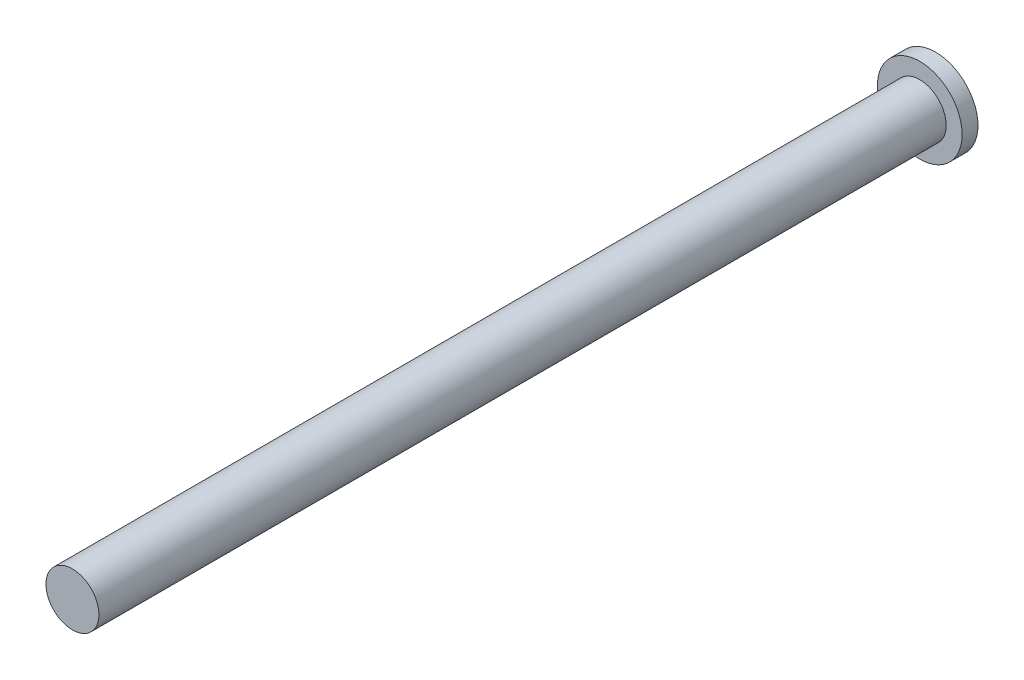
ISO-10303-21;
HEADER;
FILE_DESCRIPTION(('STEP AP214'),'2;1');
FILE_NAME('part.step','',(''),(''),'','','');
FILE_SCHEMA(('AUTOMOTIVE_DESIGN { 1 0 10303 214 1 1 1 1 }'));
ENDSEC;
DATA;
#1=APPLICATION_CONTEXT('core data for automotive mechanical design processes');
#2=APPLICATION_PROTOCOL_DEFINITION('international standard','automotive_design',2000,#1);
#3=PRODUCT_CONTEXT('',#1,'mechanical');
#4=PRODUCT('Part','Part','',(#3));
#5=PRODUCT_RELATED_PRODUCT_CATEGORY('part','',(#4));
#6=PRODUCT_DEFINITION_FORMATION('','',#4);
#7=PRODUCT_DEFINITION_CONTEXT('part definition',#1,'design');
#8=PRODUCT_DEFINITION('design','',#6,#7);
#9=PRODUCT_DEFINITION_SHAPE('','',#8);
#10=(LENGTH_UNIT() NAMED_UNIT(*) SI_UNIT(.MILLI.,.METRE.));
#11=(NAMED_UNIT(*) PLANE_ANGLE_UNIT() SI_UNIT($,.RADIAN.));
#12=(NAMED_UNIT(*) SI_UNIT($,.STERADIAN.) SOLID_ANGLE_UNIT());
#13=UNCERTAINTY_MEASURE_WITH_UNIT(LENGTH_MEASURE(1.E-05),#10,'distance_accuracy_value','');
#14=(GEOMETRIC_REPRESENTATION_CONTEXT(3) GLOBAL_UNCERTAINTY_ASSIGNED_CONTEXT((#13)) GLOBAL_UNIT_ASSIGNED_CONTEXT((#10,
#11,#12)) REPRESENTATION_CONTEXT('',''));
#15=CARTESIAN_POINT('',(0.,0.,0.));
#16=DIRECTION('',(0.,0.,1.));
#17=DIRECTION('',(1.,0.,0.));
#18=AXIS2_PLACEMENT_3D('',#15,#16,#17);
#19=CARTESIAN_POINT('',(0.,0.,1.5));
#20=DIRECTION('',(0.,0.,-1.));
#21=DIRECTION('',(-1.,0.,0.));
#22=AXIS2_PLACEMENT_3D('',#19,#20,#21);
#23=CYLINDRICAL_SURFACE('',#22,4.);
#24=CARTESIAN_POINT('',(0.,0.,1.5));
#25=DIRECTION('',(0.,0.,1.));
#26=DIRECTION('',(1.,0.,0.));
#27=AXIS2_PLACEMENT_3D('',#24,#25,#26);
#28=CIRCLE('',#27,4.);
#29=CARTESIAN_POINT('',(4.,0.,1.5));
#30=VERTEX_POINT('',#29);
#31=EDGE_CURVE('E10',#30,#30,#28,.T.);
#32=ORIENTED_EDGE('',*,*,#31,.F.);
#33=EDGE_LOOP('',(#32));
#34=FACE_BOUND('',#33,.T.);
#35=CARTESIAN_POINT('',(0.,0.,0.));
#36=DIRECTION('',(0.,0.,1.));
#37=DIRECTION('',(1.,0.,0.));
#38=AXIS2_PLACEMENT_3D('',#35,#36,#37);
#39=CIRCLE('',#38,4.);
#40=CARTESIAN_POINT('',(4.,0.,0.));
#41=VERTEX_POINT('',#40);
#42=EDGE_CURVE('E34',#41,#41,#39,.T.);
#43=ORIENTED_EDGE('',*,*,#42,.T.);
#44=EDGE_LOOP('',(#43));
#45=FACE_BOUND('',#44,.T.);
#46=ADVANCED_FACE('F31',(#34,#45),#23,.T.);
#47=CARTESIAN_POINT('',(0.,0.,1.5));
#48=DIRECTION('',(0.,0.,1.));
#49=DIRECTION('',(1.,0.,0.));
#50=AXIS2_PLACEMENT_3D('',#47,#48,#49);
#51=PLANE('',#50);
#52=CARTESIAN_POINT('',(0.,0.,1.5));
#53=DIRECTION('',(0.,0.,1.));
#54=DIRECTION('',(1.,0.,0.));
#55=AXIS2_PLACEMENT_3D('',#52,#53,#54);
#56=CIRCLE('',#55,2.5);
#57=CARTESIAN_POINT('',(2.5,0.,1.5));
#58=VERTEX_POINT('',#57);
#59=EDGE_CURVE('E43',#58,#58,#56,.T.);
#60=ORIENTED_EDGE('',*,*,#59,.F.);
#61=EDGE_LOOP('',(#60));
#62=FACE_BOUND('',#61,.T.);
#63=ORIENTED_EDGE('',*,*,#31,.T.);
#64=EDGE_LOOP('',(#63));
#65=FACE_BOUND('',#64,.T.);
#66=ADVANCED_FACE('F58',(#62,#65),#51,.T.);
#67=CARTESIAN_POINT('',(0.,0.,0.));
#68=DIRECTION('',(0.,0.,1.));
#69=DIRECTION('',(1.,0.,0.));
#70=AXIS2_PLACEMENT_3D('',#67,#68,#69);
#71=PLANE('',#70);
#72=ORIENTED_EDGE('',*,*,#42,.F.);
#73=EDGE_LOOP('',(#72));
#74=FACE_BOUND('',#73,.T.);
#75=ADVANCED_FACE('F54',(#74),#71,.F.);
#76=CARTESIAN_POINT('',(0.,0.,81.5));
#77=DIRECTION('',(0.,0.,-1.));
#78=DIRECTION('',(-1.,0.,0.));
#79=AXIS2_PLACEMENT_3D('',#76,#77,#78);
#80=CYLINDRICAL_SURFACE('',#79,2.5);
#81=CARTESIAN_POINT('',(0.,0.,81.5));
#82=DIRECTION('',(0.,0.,1.));
#83=DIRECTION('',(1.,0.,0.));
#84=AXIS2_PLACEMENT_3D('',#81,#82,#83);
#85=CIRCLE('',#84,2.5);
#86=CARTESIAN_POINT('',(2.5,0.,81.5));
#87=VERTEX_POINT('',#86);
#88=EDGE_CURVE('E41',#87,#87,#85,.T.);
#89=ORIENTED_EDGE('',*,*,#88,.F.);
#90=EDGE_LOOP('',(#89));
#91=FACE_BOUND('',#90,.T.);
#92=ORIENTED_EDGE('',*,*,#59,.T.);
#93=EDGE_LOOP('',(#92));
#94=FACE_BOUND('',#93,.T.);
#95=ADVANCED_FACE('F51',(#91,#94),#80,.T.);
#96=CARTESIAN_POINT('',(0.,0.,81.5));
#97=DIRECTION('',(0.,0.,1.));
#98=DIRECTION('',(1.,0.,0.));
#99=AXIS2_PLACEMENT_3D('',#96,#97,#98);
#100=PLANE('',#99);
#101=ORIENTED_EDGE('',*,*,#88,.T.);
#102=EDGE_LOOP('',(#101));
#103=FACE_BOUND('',#102,.T.);
#104=ADVANCED_FACE('F49',(#103),#100,.T.);
#105=CLOSED_SHELL('',(#46,#66,#75,#95,#104));
#106=MANIFOLD_SOLID_BREP('B2',#105);
#107=ADVANCED_BREP_SHAPE_REPRESENTATION('',(#18,#106),#14);
#108=SHAPE_DEFINITION_REPRESENTATION(#9,#107);
ENDSEC;
END-ISO-10303-21;
